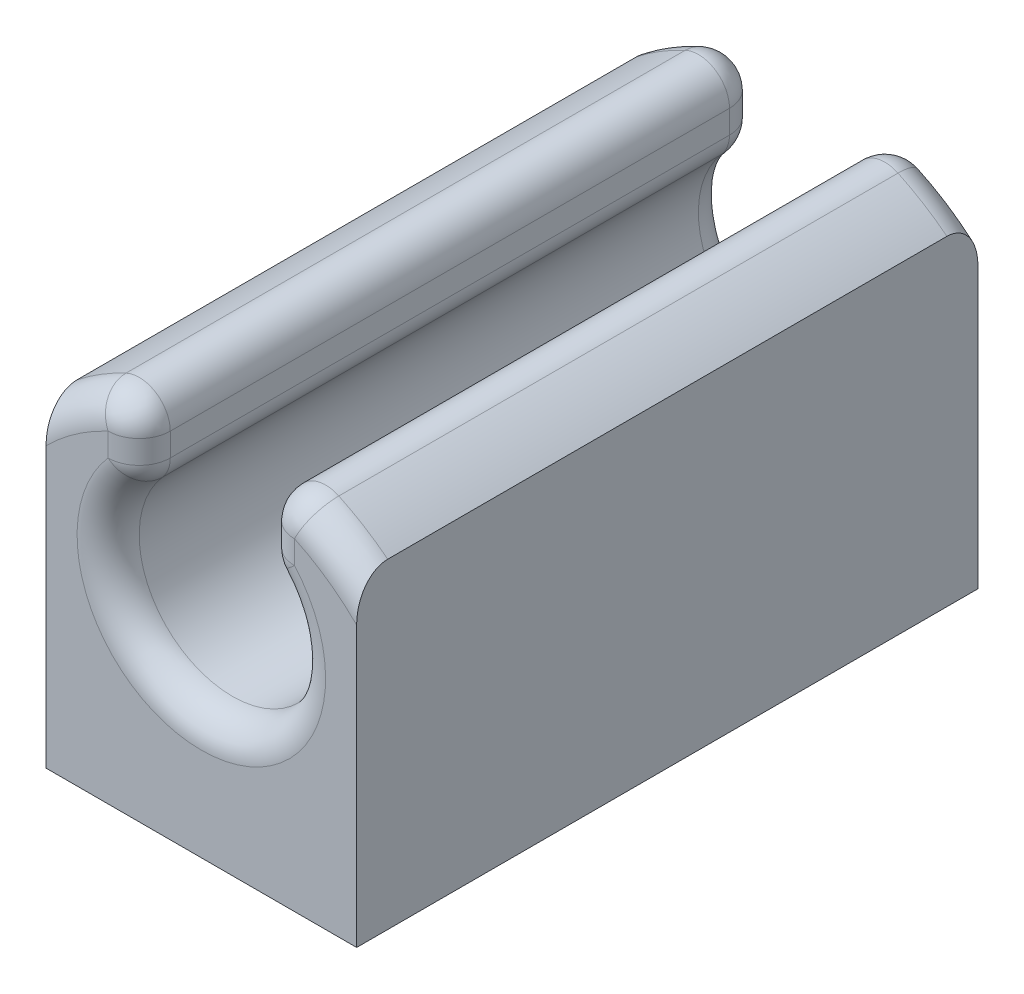
ISO-10303-21;
HEADER;
FILE_DESCRIPTION(('STEP AP214'),'2;1');
FILE_NAME('part.step','',(''),(''),'','','');
FILE_SCHEMA(('AUTOMOTIVE_DESIGN { 1 0 10303 214 1 1 1 1 }'));
ENDSEC;
DATA;
#1=APPLICATION_CONTEXT('core data for automotive mechanical design processes');
#2=APPLICATION_PROTOCOL_DEFINITION('international standard','automotive_design',2000,#1);
#3=PRODUCT_CONTEXT('',#1,'mechanical');
#4=PRODUCT('Part','Part','',(#3));
#5=PRODUCT_RELATED_PRODUCT_CATEGORY('part','',(#4));
#6=PRODUCT_DEFINITION_FORMATION('','',#4);
#7=PRODUCT_DEFINITION_CONTEXT('part definition',#1,'design');
#8=PRODUCT_DEFINITION('design','',#6,#7);
#9=PRODUCT_DEFINITION_SHAPE('','',#8);
#10=(LENGTH_UNIT() NAMED_UNIT(*) SI_UNIT(.MILLI.,.METRE.));
#11=(NAMED_UNIT(*) PLANE_ANGLE_UNIT() SI_UNIT($,.RADIAN.));
#12=(NAMED_UNIT(*) SI_UNIT($,.STERADIAN.) SOLID_ANGLE_UNIT());
#13=UNCERTAINTY_MEASURE_WITH_UNIT(LENGTH_MEASURE(1.E-05),#10,'distance_accuracy_value','');
#14=(GEOMETRIC_REPRESENTATION_CONTEXT(3) GLOBAL_UNCERTAINTY_ASSIGNED_CONTEXT((#13)) GLOBAL_UNIT_ASSIGNED_CONTEXT((#10,
#11,#12)) REPRESENTATION_CONTEXT('',''));
#15=CARTESIAN_POINT('',(0.,0.,0.));
#16=DIRECTION('',(0.,0.,1.));
#17=DIRECTION('',(1.,0.,0.));
#18=AXIS2_PLACEMENT_3D('',#15,#16,#17);
#19=CARTESIAN_POINT('',(0.,-1.5,0.));
#20=DIRECTION('',(0.,0.,1.));
#21=DIRECTION('',(1.,0.,0.));
#22=AXIS2_PLACEMENT_3D('',#19,#20,#21);
#23=CYLINDRICAL_SURFACE('',#22,4.03112887414927);
#24=DIRECTION('',(0.,0.,1.));
#25=VECTOR('',#24,1.);
#26=CARTESIAN_POINT('',(1.71239666597575,2.14934208568547,0.));
#27=LINE('',#26,#25);
#28=CARTESIAN_POINT('',(1.71239666597575,2.14934208568547,0.5));
#29=VERTEX_POINT('',#28);
#30=CARTESIAN_POINT('',(1.71239666597575,2.14934208568547,9.5));
#31=VERTEX_POINT('',#30);
#32=EDGE_CURVE('E275',#29,#31,#27,.T.);
#33=ORIENTED_EDGE('',*,*,#32,.T.);
#34=CARTESIAN_POINT('',(0.,-1.5,9.5));
#35=DIRECTION('',(0.,0.,1.));
#36=DIRECTION('',(1.,0.,0.));
#37=AXIS2_PLACEMENT_3D('',#34,#35,#36);
#38=CIRCLE('',#37,4.03112887414927);
#39=CARTESIAN_POINT('',(2.5,1.66227766016838,9.5));
#40=VERTEX_POINT('',#39);
#41=EDGE_CURVE('E279',#31,#40,#38,.F.);
#42=ORIENTED_EDGE('',*,*,#41,.T.);
#43=DIRECTION('',(0.,0.,1.));
#44=VECTOR('',#43,1.);
#45=CARTESIAN_POINT('',(2.5,1.66227766016838,0.));
#46=LINE('',#45,#44);
#47=CARTESIAN_POINT('',(2.5,1.66227766016838,0.5));
#48=VERTEX_POINT('',#47);
#49=EDGE_CURVE('E174',#48,#40,#46,.T.);
#50=ORIENTED_EDGE('',*,*,#49,.F.);
#51=CARTESIAN_POINT('',(0.,-1.5,0.5));
#52=DIRECTION('',(0.,0.,1.));
#53=DIRECTION('',(1.,0.,0.));
#54=AXIS2_PLACEMENT_3D('',#51,#52,#53);
#55=CIRCLE('',#54,4.03112887414927);
#56=EDGE_CURVE('E277',#48,#29,#55,.T.);
#57=ORIENTED_EDGE('',*,*,#56,.T.);
#58=EDGE_LOOP('',(#33,#42,#50,#57));
#59=FACE_BOUND('',#58,.T.);
#60=ADVANCED_FACE('F35',(#59),#23,.T.);
#61=CARTESIAN_POINT('',(0.,0.,10.));
#62=DIRECTION('',(0.,0.,1.));
#63=DIRECTION('',(1.,0.,0.));
#64=AXIS2_PLACEMENT_3D('',#61,#62,#63);
#65=PLANE('',#64);
#66=DIRECTION('',(0.,-1.,0.));
#67=VECTOR('',#66,1.);
#68=CARTESIAN_POINT('',(2.5,-3.5,10.));
#69=LINE('',#68,#67);
#70=CARTESIAN_POINT('',(2.5,0.993766453750375,10.));
#71=VERTEX_POINT('',#70);
#72=CARTESIAN_POINT('',(2.5,-3.5,10.));
#73=VERTEX_POINT('',#72);
#74=EDGE_CURVE('E181',#71,#73,#69,.T.);
#75=ORIENTED_EDGE('',*,*,#74,.F.);
#76=CARTESIAN_POINT('',(0.,-1.5,10.));
#77=DIRECTION('',(0.,0.,1.));
#78=DIRECTION('',(1.,0.,0.));
#79=AXIS2_PLACEMENT_3D('',#76,#77,#78);
#80=CIRCLE('',#79,3.53112887414928);
#81=CARTESIAN_POINT('',(1.5,1.69669690866224,10.));
#82=VERTEX_POINT('',#81);
#83=EDGE_CURVE('E272',#71,#82,#80,.T.);
#84=ORIENTED_EDGE('',*,*,#83,.T.);
#85=DIRECTION('',(0.,1.,0.));
#86=VECTOR('',#85,1.);
#87=CARTESIAN_POINT('',(1.5,1.73205080756888,10.));
#88=LINE('',#87,#86);
#89=CARTESIAN_POINT('',(1.5,1.3228756555323,10.));
#90=VERTEX_POINT('',#89);
#91=EDGE_CURVE('E216',#82,#90,#88,.F.);
#92=ORIENTED_EDGE('',*,*,#91,.T.);
#93=CARTESIAN_POINT('',(0.,0.,10.));
#94=DIRECTION('',(0.,0.,1.));
#95=DIRECTION('',(1.,0.,0.));
#96=AXIS2_PLACEMENT_3D('',#93,#94,#95);
#97=CIRCLE('',#96,2.);
#98=CARTESIAN_POINT('',(-1.5,1.3228756555323,10.));
#99=VERTEX_POINT('',#98);
#100=EDGE_CURVE('E204',#90,#99,#97,.F.);
#101=ORIENTED_EDGE('',*,*,#100,.T.);
#102=DIRECTION('',(0.,-1.,0.));
#103=VECTOR('',#102,1.);
#104=CARTESIAN_POINT('',(-1.5,2.40512483795333,10.));
#105=LINE('',#104,#103);
#106=CARTESIAN_POINT('',(-1.5,1.69669690866224,10.));
#107=VERTEX_POINT('',#106);
#108=EDGE_CURVE('E251',#99,#107,#105,.F.);
#109=ORIENTED_EDGE('',*,*,#108,.T.);
#110=CARTESIAN_POINT('',(0.,-1.5,10.));
#111=DIRECTION('',(0.,0.,1.));
#112=DIRECTION('',(1.,0.,0.));
#113=AXIS2_PLACEMENT_3D('',#110,#111,#112);
#114=CIRCLE('',#113,3.53112887414928);
#115=CARTESIAN_POINT('',(-2.5,0.993766453750375,10.));
#116=VERTEX_POINT('',#115);
#117=EDGE_CURVE('E258',#107,#116,#114,.T.);
#118=ORIENTED_EDGE('',*,*,#117,.T.);
#119=DIRECTION('',(0.,1.,0.));
#120=VECTOR('',#119,1.);
#121=CARTESIAN_POINT('',(-2.5,0.,10.));
#122=LINE('',#121,#120);
#123=CARTESIAN_POINT('',(-2.5,-3.5,10.));
#124=VERTEX_POINT('',#123);
#125=EDGE_CURVE('E190',#124,#116,#122,.T.);
#126=ORIENTED_EDGE('',*,*,#125,.F.);
#127=DIRECTION('',(1.,0.,0.));
#128=VECTOR('',#127,1.);
#129=CARTESIAN_POINT('',(-3.5,-3.5,10.));
#130=LINE('',#129,#128);
#131=EDGE_CURVE('E189',#124,#73,#130,.T.);
#132=ORIENTED_EDGE('',*,*,#131,.T.);
#133=EDGE_LOOP('',(#75,#84,#92,#101,#109,#118,#126,#132));
#134=FACE_BOUND('',#133,.T.);
#135=ADVANCED_FACE('F347',(#134),#65,.T.);
#136=CARTESIAN_POINT('',(0.,0.,0.));
#137=DIRECTION('',(0.,0.,1.));
#138=DIRECTION('',(1.,0.,0.));
#139=AXIS2_PLACEMENT_3D('',#136,#137,#138);
#140=PLANE('',#139);
#141=DIRECTION('',(0.,1.,0.));
#142=VECTOR('',#141,1.);
#143=CARTESIAN_POINT('',(1.5,0.,0.));
#144=LINE('',#143,#142);
#145=CARTESIAN_POINT('',(1.5,1.3228756555323,0.));
#146=VERTEX_POINT('',#145);
#147=CARTESIAN_POINT('',(1.5,1.69669690866224,0.));
#148=VERTEX_POINT('',#147);
#149=EDGE_CURVE('E221',#146,#148,#144,.T.);
#150=ORIENTED_EDGE('',*,*,#149,.T.);
#151=CARTESIAN_POINT('',(0.,-1.5,0.));
#152=DIRECTION('',(0.,0.,1.));
#153=DIRECTION('',(1.,0.,0.));
#154=AXIS2_PLACEMENT_3D('',#151,#152,#153);
#155=CIRCLE('',#154,3.53112887414928);
#156=CARTESIAN_POINT('',(2.5,0.993766453750376,0.));
#157=VERTEX_POINT('',#156);
#158=EDGE_CURVE('E171',#148,#157,#155,.F.);
#159=ORIENTED_EDGE('',*,*,#158,.T.);
#160=DIRECTION('',(0.,-1.,0.));
#161=VECTOR('',#160,1.);
#162=CARTESIAN_POINT('',(2.5,0.,0.));
#163=LINE('',#162,#161);
#164=CARTESIAN_POINT('',(2.5,-3.5,0.));
#165=VERTEX_POINT('',#164);
#166=EDGE_CURVE('E163',#157,#165,#163,.T.);
#167=ORIENTED_EDGE('',*,*,#166,.T.);
#168=DIRECTION('',(1.,0.,0.));
#169=VECTOR('',#168,1.);
#170=CARTESIAN_POINT('',(-3.5,-3.5,0.));
#171=LINE('',#170,#169);
#172=CARTESIAN_POINT('',(-2.5,-3.5,0.));
#173=VERTEX_POINT('',#172);
#174=EDGE_CURVE('E169',#173,#165,#171,.T.);
#175=ORIENTED_EDGE('',*,*,#174,.F.);
#176=DIRECTION('',(0.,-1.,0.));
#177=VECTOR('',#176,1.);
#178=CARTESIAN_POINT('',(-2.5,-3.5,0.));
#179=LINE('',#178,#177);
#180=CARTESIAN_POINT('',(-2.5,0.993766453750375,0.));
#181=VERTEX_POINT('',#180);
#182=EDGE_CURVE('E428',#181,#173,#179,.T.);
#183=ORIENTED_EDGE('',*,*,#182,.F.);
#184=CARTESIAN_POINT('',(0.,-1.5,0.));
#185=DIRECTION('',(0.,0.,1.));
#186=DIRECTION('',(1.,0.,0.));
#187=AXIS2_PLACEMENT_3D('',#184,#185,#186);
#188=CIRCLE('',#187,3.53112887414928);
#189=CARTESIAN_POINT('',(-1.5,1.69669690866224,0.));
#190=VERTEX_POINT('',#189);
#191=EDGE_CURVE('E392',#181,#190,#188,.F.);
#192=ORIENTED_EDGE('',*,*,#191,.T.);
#193=DIRECTION('',(0.,-1.,0.));
#194=VECTOR('',#193,1.);
#195=CARTESIAN_POINT('',(-1.5,0.,0.));
#196=LINE('',#195,#194);
#197=CARTESIAN_POINT('',(-1.5,1.3228756555323,0.));
#198=VERTEX_POINT('',#197);
#199=EDGE_CURVE('E228',#190,#198,#196,.T.);
#200=ORIENTED_EDGE('',*,*,#199,.T.);
#201=CARTESIAN_POINT('',(0.,0.,0.));
#202=DIRECTION('',(0.,0.,1.));
#203=DIRECTION('',(1.,0.,0.));
#204=AXIS2_PLACEMENT_3D('',#201,#202,#203);
#205=CIRCLE('',#204,2.);
#206=EDGE_CURVE('E207',#198,#146,#205,.T.);
#207=ORIENTED_EDGE('',*,*,#206,.T.);
#208=EDGE_LOOP('',(#150,#159,#167,#175,#183,#192,#200,#207));
#209=FACE_BOUND('',#208,.T.);
#210=ADVANCED_FACE('F166',(#209),#140,.F.);
#211=CARTESIAN_POINT('',(-3.5,-3.5,10.));
#212=DIRECTION('',(0.,1.,0.));
#213=DIRECTION('',(0.,0.,1.));
#214=AXIS2_PLACEMENT_3D('',#211,#212,#213);
#215=PLANE('',#214);
#216=ORIENTED_EDGE('',*,*,#174,.T.);
#217=DIRECTION('',(0.,0.,-1.));
#218=VECTOR('',#217,1.);
#219=CARTESIAN_POINT('',(2.5,-3.5,10.));
#220=LINE('',#219,#218);
#221=EDGE_CURVE('E175',#73,#165,#220,.T.);
#222=ORIENTED_EDGE('',*,*,#221,.F.);
#223=ORIENTED_EDGE('',*,*,#131,.F.);
#224=DIRECTION('',(0.,0.,1.));
#225=VECTOR('',#224,1.);
#226=CARTESIAN_POINT('',(-2.5,-3.5,0.));
#227=LINE('',#226,#225);
#228=EDGE_CURVE('E188',#173,#124,#227,.T.);
#229=ORIENTED_EDGE('',*,*,#228,.F.);
#230=EDGE_LOOP('',(#216,#222,#223,#229));
#231=FACE_BOUND('',#230,.T.);
#232=ADVANCED_FACE('F187',(#231),#215,.F.);
#233=DIRECTION('',(0.,0.,1.));
#234=VECTOR('',#233,1.);
#235=CARTESIAN_POINT('',(-1.71239666597575,2.14934208568547,0.));
#236=LINE('',#235,#234);
#237=CARTESIAN_POINT('',(-1.71239666597575,2.14934208568547,9.5));
#238=VERTEX_POINT('',#237);
#239=CARTESIAN_POINT('',(-1.71239666597575,2.14934208568547,0.5));
#240=VERTEX_POINT('',#239);
#241=EDGE_CURVE('E368',#238,#240,#236,.F.);
#242=ORIENTED_EDGE('',*,*,#241,.T.);
#243=CARTESIAN_POINT('',(0.,-1.5,0.5));
#244=DIRECTION('',(0.,0.,1.));
#245=DIRECTION('',(1.,0.,0.));
#246=AXIS2_PLACEMENT_3D('',#243,#244,#245);
#247=CIRCLE('',#246,4.03112887414927);
#248=CARTESIAN_POINT('',(-2.5,1.66227766016838,0.5));
#249=VERTEX_POINT('',#248);
#250=EDGE_CURVE('E372',#240,#249,#247,.T.);
#251=ORIENTED_EDGE('',*,*,#250,.T.);
#252=DIRECTION('',(0.,0.,1.));
#253=VECTOR('',#252,1.);
#254=CARTESIAN_POINT('',(-2.5,1.66227766016838,0.));
#255=LINE('',#254,#253);
#256=CARTESIAN_POINT('',(-2.5,1.66227766016838,9.5));
#257=VERTEX_POINT('',#256);
#258=EDGE_CURVE('E192',#257,#249,#255,.F.);
#259=ORIENTED_EDGE('',*,*,#258,.F.);
#260=CARTESIAN_POINT('',(0.,-1.5,9.5));
#261=DIRECTION('',(0.,0.,1.));
#262=DIRECTION('',(1.,0.,0.));
#263=AXIS2_PLACEMENT_3D('',#260,#261,#262);
#264=CIRCLE('',#263,4.03112887414927);
#265=EDGE_CURVE('E374',#257,#238,#264,.F.);
#266=ORIENTED_EDGE('',*,*,#265,.T.);
#267=EDGE_LOOP('',(#242,#251,#259,#266));
#268=FACE_BOUND('',#267,.T.);
#269=ADVANCED_FACE('F350',(#268),#23,.T.);
#270=CARTESIAN_POINT('',(0.,0.,0.));
#271=DIRECTION('',(0.,0.,1.));
#272=DIRECTION('',(1.,0.,0.));
#273=AXIS2_PLACEMENT_3D('',#270,#271,#272);
#274=CYLINDRICAL_SURFACE('',#273,1.5);
#275=CARTESIAN_POINT('',(0.,0.,0.5));
#276=DIRECTION('',(0.,0.,1.));
#277=DIRECTION('',(1.,0.,0.));
#278=AXIS2_PLACEMENT_3D('',#275,#276,#277);
#279=CIRCLE('',#278,1.5);
#280=CARTESIAN_POINT('',(1.125,0.992156741649222,0.5));
#281=VERTEX_POINT('',#280);
#282=CARTESIAN_POINT('',(-1.125,0.992156741649222,0.5));
#283=VERTEX_POINT('',#282);
#284=EDGE_CURVE('E199',#281,#283,#279,.F.);
#285=ORIENTED_EDGE('',*,*,#284,.T.);
#286=DIRECTION('',(0.,0.,1.));
#287=VECTOR('',#286,1.);
#288=CARTESIAN_POINT('',(-1.125,0.992156741649222,0.));
#289=LINE('',#288,#287);
#290=CARTESIAN_POINT('',(-1.125,0.992156741649222,9.5));
#291=VERTEX_POINT('',#290);
#292=EDGE_CURVE('E256',#283,#291,#289,.T.);
#293=ORIENTED_EDGE('',*,*,#292,.T.);
#294=CARTESIAN_POINT('',(0.,0.,9.5));
#295=DIRECTION('',(0.,0.,1.));
#296=DIRECTION('',(1.,0.,0.));
#297=AXIS2_PLACEMENT_3D('',#294,#295,#296);
#298=CIRCLE('',#297,1.5);
#299=CARTESIAN_POINT('',(1.125,0.992156741649222,9.5));
#300=VERTEX_POINT('',#299);
#301=EDGE_CURVE('E202',#291,#300,#298,.T.);
#302=ORIENTED_EDGE('',*,*,#301,.T.);
#303=DIRECTION('',(0.,0.,1.));
#304=VECTOR('',#303,1.);
#305=CARTESIAN_POINT('',(1.125,0.992156741649222,0.));
#306=LINE('',#305,#304);
#307=EDGE_CURVE('E226',#300,#281,#306,.F.);
#308=ORIENTED_EDGE('',*,*,#307,.T.);
#309=EDGE_LOOP('',(#285,#293,#302,#308));
#310=FACE_BOUND('',#309,.T.);
#311=ADVANCED_FACE('F358',(#310),#274,.F.);
#312=CARTESIAN_POINT('',(-1.,2.73267556107915,0.));
#313=DIRECTION('',(-1.,0.,0.));
#314=DIRECTION('',(0.,-1.,0.));
#315=AXIS2_PLACEMENT_3D('',#312,#313,#314);
#316=PLANE('',#315);
#317=DIRECTION('',(0.,-1.,0.));
#318=VECTOR('',#317,1.);
#319=CARTESIAN_POINT('',(-1.,2.73267556107915,0.5));
#320=LINE('',#319,#318);
#321=CARTESIAN_POINT('',(-1.,1.3228756555323,0.5));
#322=VERTEX_POINT('',#321);
#323=CARTESIAN_POINT('',(-1.,1.69669690866224,0.5));
#324=VERTEX_POINT('',#323);
#325=EDGE_CURVE('E247',#322,#324,#320,.F.);
#326=ORIENTED_EDGE('',*,*,#325,.T.);
#327=DIRECTION('',(0.,0.,-1.));
#328=VECTOR('',#327,1.);
#329=CARTESIAN_POINT('',(-1.,1.69669690866224,9.5));
#330=LINE('',#329,#328);
#331=CARTESIAN_POINT('',(-1.,1.69669690866224,9.5));
#332=VERTEX_POINT('',#331);
#333=EDGE_CURVE('E11',#324,#332,#330,.F.);
#334=ORIENTED_EDGE('',*,*,#333,.T.);
#335=DIRECTION('',(0.,-1.,0.));
#336=VECTOR('',#335,1.);
#337=CARTESIAN_POINT('',(-1.,1.73205080756888,9.5));
#338=LINE('',#337,#336);
#339=CARTESIAN_POINT('',(-1.,1.3228756555323,9.5));
#340=VERTEX_POINT('',#339);
#341=EDGE_CURVE('E245',#332,#340,#338,.T.);
#342=ORIENTED_EDGE('',*,*,#341,.T.);
#343=DIRECTION('',(0.,0.,1.));
#344=VECTOR('',#343,1.);
#345=CARTESIAN_POINT('',(-1.,1.3228756555323,0.));
#346=LINE('',#345,#344);
#347=EDGE_CURVE('E243',#340,#322,#346,.F.);
#348=ORIENTED_EDGE('',*,*,#347,.T.);
#349=EDGE_LOOP('',(#326,#334,#342,#348));
#350=FACE_BOUND('',#349,.T.);
#351=ADVANCED_FACE('F309',(#350),#316,.F.);
#352=CARTESIAN_POINT('',(1.,2.73267556107915,0.));
#353=DIRECTION('',(1.,0.,0.));
#354=DIRECTION('',(0.,1.,0.));
#355=AXIS2_PLACEMENT_3D('',#352,#353,#354);
#356=PLANE('',#355);
#357=DIRECTION('',(0.,1.,0.));
#358=VECTOR('',#357,1.);
#359=CARTESIAN_POINT('',(1.,2.40512483795333,9.5));
#360=LINE('',#359,#358);
#361=CARTESIAN_POINT('',(1.,1.3228756555323,9.5));
#362=VERTEX_POINT('',#361);
#363=CARTESIAN_POINT('',(1.,1.69669690866224,9.5));
#364=VERTEX_POINT('',#363);
#365=EDGE_CURVE('E213',#362,#364,#360,.T.);
#366=ORIENTED_EDGE('',*,*,#365,.T.);
#367=DIRECTION('',(0.,0.,-1.));
#368=VECTOR('',#367,1.);
#369=CARTESIAN_POINT('',(1.,1.69669690866224,0.5));
#370=LINE('',#369,#368);
#371=CARTESIAN_POINT('',(1.,1.69669690866224,0.5));
#372=VERTEX_POINT('',#371);
#373=EDGE_CURVE('E45',#364,#372,#370,.T.);
#374=ORIENTED_EDGE('',*,*,#373,.T.);
#375=DIRECTION('',(0.,1.,0.));
#376=VECTOR('',#375,1.);
#377=CARTESIAN_POINT('',(1.,2.73267556107915,0.5));
#378=LINE('',#377,#376);
#379=CARTESIAN_POINT('',(1.,1.3228756555323,0.5));
#380=VERTEX_POINT('',#379);
#381=EDGE_CURVE('E211',#372,#380,#378,.F.);
#382=ORIENTED_EDGE('',*,*,#381,.T.);
#383=DIRECTION('',(0.,0.,1.));
#384=VECTOR('',#383,1.);
#385=CARTESIAN_POINT('',(1.,1.3228756555323,0.));
#386=LINE('',#385,#384);
#387=EDGE_CURVE('E209',#380,#362,#386,.T.);
#388=ORIENTED_EDGE('',*,*,#387,.T.);
#389=EDGE_LOOP('',(#366,#374,#382,#388));
#390=FACE_BOUND('',#389,.T.);
#391=ADVANCED_FACE('F307',(#390),#356,.F.);
#392=CARTESIAN_POINT('',(-2.5,0.,0.));
#393=DIRECTION('',(1.,0.,0.));
#394=DIRECTION('',(0.,1.,0.));
#395=AXIS2_PLACEMENT_3D('',#392,#393,#394);
#396=PLANE('',#395);
#397=ORIENTED_EDGE('',*,*,#258,.T.);
#398=CARTESIAN_POINT('',(-2.5,1.66227766016838,0.5));
#399=CARTESIAN_POINT('',(-2.5,1.66232077918021,0.476304674534329));
#400=CARTESIAN_POINT('',(-2.5,1.66013370792202,0.452646607475394));
#401=CARTESIAN_POINT('',(-2.5,1.65165641899006,0.406215760189243));
#402=CARTESIAN_POINT('',(-2.5,1.64539049226528,0.383438579389136));
#403=CARTESIAN_POINT('',(-2.5,1.62911727138701,0.339317295613441));
#404=CARTESIAN_POINT('',(-2.5,1.61911549801442,0.317971132532818));
#405=CARTESIAN_POINT('',(-2.5,1.59588464325179,0.277097798122869));
#406=CARTESIAN_POINT('',(-2.5,1.58265143800617,0.257572995512234));
#407=CARTESIAN_POINT('',(-2.5,1.55255488517263,0.219426529009171));
#408=CARTESIAN_POINT('',(-2.5,1.53550980201501,0.200949134813798));
#409=CARTESIAN_POINT('',(-2.5,1.49903707999838,0.166553835794158));
#410=CARTESIAN_POINT('',(-2.5,1.47960933879054,0.1506360409873));
#411=CARTESIAN_POINT('',(-2.5,1.42867344287397,0.113995908141239));
#412=CARTESIAN_POINT('',(-2.5,1.39600308615875,0.0948825068169988));
#413=CARTESIAN_POINT('',(-2.5,1.32791643207717,0.0621447909442878));
#414=CARTESIAN_POINT('',(-2.5,1.29248868723036,0.0485449934419612));
#415=CARTESIAN_POINT('',(-2.5,1.21363631074044,0.024540389036504));
#416=CARTESIAN_POINT('',(-2.5,1.1699120174574,0.015137431583785));
#417=CARTESIAN_POINT('',(-2.5,1.08199515840217,0.00290912052731755));
#418=CARTESIAN_POINT('',(-2.5,1.03781209532501,1.68251955861677E-05));
#419=CARTESIAN_POINT('',(-2.5,0.993766453750375,0.));
#420=B_SPLINE_CURVE_WITH_KNOTS('',3,(#398,#399,#400,#401,#402,#403,#404,#405,#406,#407,#408,
#409,#410,#411,#412,#413,#414,#415,#416,#417,#418,#419),.UNSPECIFIED.,.F.,.F.,(4,2,2,2,2,2,2,2,
2,2,4),(0.,0.0709264220108089,0.14143427071576,0.211838333534092,0.282332717798463,
0.357471877886496,0.432614266763932,0.545541721320132,0.658965957445471,0.792611379646446,
0.924876276889545),.UNSPECIFIED.);
#421=EDGE_CURVE('E319',#249,#181,#420,.T.);
#422=ORIENTED_EDGE('',*,*,#421,.T.);
#423=ORIENTED_EDGE('',*,*,#182,.T.);
#424=ORIENTED_EDGE('',*,*,#228,.T.);
#425=ORIENTED_EDGE('',*,*,#125,.T.);
#426=CARTESIAN_POINT('',(-2.5,0.993766453750375,10.));
#427=CARTESIAN_POINT('',(-2.5,1.0357069136894,9.99998469341569));
#428=CARTESIAN_POINT('',(-2.5,1.07775462195223,9.99736303422244));
#429=CARTESIAN_POINT('',(-2.5,1.16142830277469,9.98631956637834));
#430=CARTESIAN_POINT('',(-2.5,1.20304769859404,9.97784887897191));
#431=CARTESIAN_POINT('',(-2.5,1.27962014382049,9.95589611600509));
#432=CARTESIAN_POINT('',(-2.5,1.31477555279246,9.94313372211331));
#433=CARTESIAN_POINT('',(-2.5,1.3825907188917,9.91225988928464));
#434=CARTESIAN_POINT('',(-2.5,1.41525763850054,9.8941645931689));
#435=CARTESIAN_POINT('',(-2.5,1.47032540638765,9.85674255023804));
#436=CARTESIAN_POINT('',(-2.5,1.49344164710429,9.8384720816908));
#437=CARTESIAN_POINT('',(-2.5,1.53642505987154,9.79841208958501));
#438=CARTESIAN_POINT('',(-2.5,1.55629456934445,9.77662512032694));
#439=CARTESIAN_POINT('',(-2.5,1.58882890899494,9.73364884108992));
#440=CARTESIAN_POINT('',(-2.5,1.60214124314595,9.71295085696929));
#441=CARTESIAN_POINT('',(-2.5,1.62513548307283,9.66964388362657));
#442=CARTESIAN_POINT('',(-2.5,1.63482337742583,9.647038123018));
#443=CARTESIAN_POINT('',(-2.5,1.64891793424122,9.6038495633674));
#444=CARTESIAN_POINT('',(-2.5,1.65388751393434,9.5834502413432));
#445=CARTESIAN_POINT('',(-2.5,1.66058701269638,9.54204378718783));
#446=CARTESIAN_POINT('',(-2.5,1.66230358090932,9.52103450800178));
#447=CARTESIAN_POINT('',(-2.5,1.66227766016838,9.5));
#448=B_SPLINE_CURVE_WITH_KNOTS('',3,(#426,#427,#428,#429,#430,#431,#432,#433,#434,#435,#436,
#437,#438,#439,#440,#441,#442,#443,#444,#445,#446,#447),.UNSPECIFIED.,.F.,.F.,(4,2,2,2,2,2,2,2,
2,2,4),(0.,0.125911893795168,0.252888939374309,0.364694804281864,0.476165646748438,
0.564231764464103,0.652234198622641,0.72575916121634,0.799162098009831,0.861897029738093,
0.92488888225349),.UNSPECIFIED.);
#449=EDGE_CURVE('E313',#116,#257,#448,.T.);
#450=ORIENTED_EDGE('',*,*,#449,.T.);
#451=EDGE_LOOP('',(#397,#422,#423,#424,#425,#450));
#452=FACE_BOUND('',#451,.T.);
#453=ADVANCED_FACE('F302',(#452),#396,.F.);
#454=CARTESIAN_POINT('',(2.5,0.,0.));
#455=DIRECTION('',(-1.,0.,0.));
#456=DIRECTION('',(0.,-1.,0.));
#457=AXIS2_PLACEMENT_3D('',#454,#455,#456);
#458=PLANE('',#457);
#459=ORIENTED_EDGE('',*,*,#49,.T.);
#460=CARTESIAN_POINT('',(2.5,1.66227766016838,9.5));
#461=CARTESIAN_POINT('',(2.5,1.66232077918021,9.52369532546567));
#462=CARTESIAN_POINT('',(2.5,1.66013370792202,9.54735339252461));
#463=CARTESIAN_POINT('',(2.5,1.65165641899006,9.59378423981076));
#464=CARTESIAN_POINT('',(2.5,1.64539049226528,9.61656142061086));
#465=CARTESIAN_POINT('',(2.5,1.62911727138701,9.66068270438656));
#466=CARTESIAN_POINT('',(2.5,1.61911549801442,9.68202886746718));
#467=CARTESIAN_POINT('',(2.5,1.59588464325179,9.72290220187713));
#468=CARTESIAN_POINT('',(2.5,1.58265143800617,9.74242700448777));
#469=CARTESIAN_POINT('',(2.5,1.55255488517263,9.78057347099083));
#470=CARTESIAN_POINT('',(2.5,1.53550980201501,9.7990508651862));
#471=CARTESIAN_POINT('',(2.5,1.49903707999838,9.83344616420584));
#472=CARTESIAN_POINT('',(2.5,1.47960933879053,9.8493639590127));
#473=CARTESIAN_POINT('',(2.5,1.42867344287397,9.88600409185876));
#474=CARTESIAN_POINT('',(2.5,1.39600308615874,9.905117493183));
#475=CARTESIAN_POINT('',(2.5,1.32791643207717,9.93785520905571));
#476=CARTESIAN_POINT('',(2.5,1.29248868723036,9.95145500655804));
#477=CARTESIAN_POINT('',(2.5,1.21363631074043,9.9754596109635));
#478=CARTESIAN_POINT('',(2.5,1.16991201745739,9.98486256841622));
#479=CARTESIAN_POINT('',(2.5,1.08199515840217,9.99709087947268));
#480=CARTESIAN_POINT('',(2.5,1.03781209532501,9.99998317480441));
#481=CARTESIAN_POINT('',(2.5,0.993766453750376,10.));
#482=B_SPLINE_CURVE_WITH_KNOTS('',3,(#460,#461,#462,#463,#464,#465,#466,#467,#468,#469,#470,
#471,#472,#473,#474,#475,#476,#477,#478,#479,#480,#481),.UNSPECIFIED.,.F.,.F.,(4,2,2,2,2,2,2,2,
2,2,4),(0.,0.0709264220108098,0.14143427071576,0.211838333534092,0.282332717798461,
0.357471877886496,0.432614266763934,0.545541721320135,0.658965957445477,0.792611379646449,
0.924876276889544),.UNSPECIFIED.);
#483=EDGE_CURVE('E288',#40,#71,#482,.T.);
#484=ORIENTED_EDGE('',*,*,#483,.T.);
#485=ORIENTED_EDGE('',*,*,#74,.T.);
#486=ORIENTED_EDGE('',*,*,#221,.T.);
#487=ORIENTED_EDGE('',*,*,#166,.F.);
#488=CARTESIAN_POINT('',(2.5,0.993766453750376,0.));
#489=CARTESIAN_POINT('',(2.5,1.0357069136894,1.53065843088306E-05));
#490=CARTESIAN_POINT('',(2.5,1.07775462195223,0.0026369657775608));
#491=CARTESIAN_POINT('',(2.5,1.16142830277469,0.0136804336216579));
#492=CARTESIAN_POINT('',(2.5,1.20304769859404,0.0221511210280879));
#493=CARTESIAN_POINT('',(2.5,1.27962014382049,0.0441038839949056));
#494=CARTESIAN_POINT('',(2.5,1.31477555279246,0.0568662778866884));
#495=CARTESIAN_POINT('',(2.5,1.3825907188917,0.0877401107153618));
#496=CARTESIAN_POINT('',(2.5,1.41525763850054,0.105835406831096));
#497=CARTESIAN_POINT('',(2.5,1.47032540638765,0.143257449761958));
#498=CARTESIAN_POINT('',(2.5,1.49344164710429,0.161527918309198));
#499=CARTESIAN_POINT('',(2.5,1.53642505987154,0.201587910414991));
#500=CARTESIAN_POINT('',(2.5,1.55629456934445,0.223374879673058));
#501=CARTESIAN_POINT('',(2.5,1.58882890899494,0.266351158910077));
#502=CARTESIAN_POINT('',(2.5,1.60214124314595,0.287049143030707));
#503=CARTESIAN_POINT('',(2.5,1.62513548307283,0.330356116373431));
#504=CARTESIAN_POINT('',(2.5,1.63482337742583,0.352961876982006));
#505=CARTESIAN_POINT('',(2.5,1.64891793424122,0.396150436632604));
#506=CARTESIAN_POINT('',(2.5,1.65388751393434,0.4165497586568));
#507=CARTESIAN_POINT('',(2.5,1.66058701269638,0.45795621281217));
#508=CARTESIAN_POINT('',(2.5,1.66230358090933,0.478965491998222));
#509=CARTESIAN_POINT('',(2.5,1.66227766016838,0.5));
#510=B_SPLINE_CURVE_WITH_KNOTS('',3,(#488,#489,#490,#491,#492,#493,#494,#495,#496,#497,#498,
#499,#500,#501,#502,#503,#504,#505,#506,#507,#508,#509),.UNSPECIFIED.,.F.,.F.,(4,2,2,2,2,2,2,2,
2,2,4),(0.,0.125911893795168,0.252888939374309,0.364694804281862,0.476165646748437,
0.564231764464103,0.652234198622642,0.725759161216344,0.799162098009832,0.861897029738092,
0.924888882253488),.UNSPECIFIED.);
#511=EDGE_CURVE('E281',#157,#48,#510,.T.);
#512=ORIENTED_EDGE('',*,*,#511,.T.);
#513=EDGE_LOOP('',(#459,#484,#485,#486,#487,#512));
#514=FACE_BOUND('',#513,.T.);
#515=ADVANCED_FACE('F179',(#514),#458,.F.);
#516=CARTESIAN_POINT('',(0.,0.,9.5));
#517=DIRECTION('',(0.,0.,1.));
#518=DIRECTION('',(1.,0.,0.));
#519=AXIS2_PLACEMENT_3D('',#516,#517,#518);
#520=TOROIDAL_SURFACE('',#519,2.,0.5);
#521=ORIENTED_EDGE('',*,*,#301,.F.);
#522=CARTESIAN_POINT('',(-1.5,1.3228756555323,9.5));
#523=DIRECTION('',(-0.661437827766148,-0.75,0.));
#524=DIRECTION('',(0.75,-0.661437827766148,0.));
#525=AXIS2_PLACEMENT_3D('',#522,#523,#524);
#526=CIRCLE('',#525,0.5);
#527=EDGE_CURVE('E254',#291,#99,#526,.T.);
#528=ORIENTED_EDGE('',*,*,#527,.T.);
#529=ORIENTED_EDGE('',*,*,#100,.F.);
#530=CARTESIAN_POINT('',(1.5,1.3228756555323,9.5));
#531=DIRECTION('',(-0.661437827766148,0.75,0.));
#532=DIRECTION('',(-0.75,-0.661437827766148,0.));
#533=AXIS2_PLACEMENT_3D('',#530,#531,#532);
#534=CIRCLE('',#533,0.5);
#535=EDGE_CURVE('E218',#90,#300,#534,.F.);
#536=ORIENTED_EDGE('',*,*,#535,.T.);
#537=EDGE_LOOP('',(#521,#528,#529,#536));
#538=FACE_BOUND('',#537,.T.);
#539=ADVANCED_FACE('F301',(#538),#520,.T.);
#540=CARTESIAN_POINT('',(0.,0.,0.5));
#541=DIRECTION('',(0.,0.,1.));
#542=DIRECTION('',(1.,0.,0.));
#543=AXIS2_PLACEMENT_3D('',#540,#541,#542);
#544=TOROIDAL_SURFACE('',#543,2.,0.5);
#545=ORIENTED_EDGE('',*,*,#206,.F.);
#546=CARTESIAN_POINT('',(-1.5,1.3228756555323,0.5));
#547=DIRECTION('',(-0.661437827766148,-0.75,0.));
#548=DIRECTION('',(0.75,-0.661437827766148,0.));
#549=AXIS2_PLACEMENT_3D('',#546,#547,#548);
#550=CIRCLE('',#549,0.5);
#551=EDGE_CURVE('E249',#198,#283,#550,.T.);
#552=ORIENTED_EDGE('',*,*,#551,.T.);
#553=ORIENTED_EDGE('',*,*,#284,.F.);
#554=CARTESIAN_POINT('',(1.5,1.3228756555323,0.5));
#555=DIRECTION('',(-0.661437827766148,0.75,0.));
#556=DIRECTION('',(-0.75,-0.661437827766148,0.));
#557=AXIS2_PLACEMENT_3D('',#554,#555,#556);
#558=CIRCLE('',#557,0.5);
#559=EDGE_CURVE('E223',#281,#146,#558,.F.);
#560=ORIENTED_EDGE('',*,*,#559,.T.);
#561=EDGE_LOOP('',(#545,#552,#553,#560));
#562=FACE_BOUND('',#561,.T.);
#563=ADVANCED_FACE('F441',(#562),#544,.T.);
#564=CARTESIAN_POINT('',(1.5,0.,0.5));
#565=DIRECTION('',(0.,1.,0.));
#566=DIRECTION('',(-1.,0.,0.));
#567=AXIS2_PLACEMENT_3D('',#564,#565,#566);
#568=CYLINDRICAL_SURFACE('',#567,0.5);
#569=ORIENTED_EDGE('',*,*,#381,.F.);
#570=CARTESIAN_POINT('',(1.5,1.69669690866224,0.5));
#571=DIRECTION('',(0.,1.,0.));
#572=DIRECTION('',(-1.,0.,0.));
#573=AXIS2_PLACEMENT_3D('',#570,#571,#572);
#574=CIRCLE('',#573,0.5);
#575=EDGE_CURVE('E377',#372,#148,#574,.F.);
#576=ORIENTED_EDGE('',*,*,#575,.T.);
#577=ORIENTED_EDGE('',*,*,#149,.F.);
#578=CARTESIAN_POINT('',(1.5,1.3228756555323,0.5));
#579=DIRECTION('',(0.,-1.,0.));
#580=DIRECTION('',(0.,0.,-1.));
#581=AXIS2_PLACEMENT_3D('',#578,#579,#580);
#582=CIRCLE('',#581,0.5);
#583=EDGE_CURVE('E239',#380,#146,#582,.T.);
#584=ORIENTED_EDGE('',*,*,#583,.F.);
#585=EDGE_LOOP('',(#569,#576,#577,#584));
#586=FACE_BOUND('',#585,.T.);
#587=ADVANCED_FACE('F481',(#586),#568,.T.);
#588=CARTESIAN_POINT('',(1.5,1.3228756555323,0.5));
#589=DIRECTION('',(1.,0.,0.));
#590=DIRECTION('',(0.,1.,0.));
#591=AXIS2_PLACEMENT_3D('',#588,#589,#590);
#592=SPHERICAL_SURFACE('',#591,0.5);
#593=ORIENTED_EDGE('',*,*,#583,.T.);
#594=ORIENTED_EDGE('',*,*,#559,.F.);
#595=CARTESIAN_POINT('',(1.5,1.3228756555323,0.5));
#596=DIRECTION('',(0.,0.,1.));
#597=DIRECTION('',(1.,0.,0.));
#598=AXIS2_PLACEMENT_3D('',#595,#596,#597);
#599=CIRCLE('',#598,0.5);
#600=EDGE_CURVE('E236',#380,#281,#599,.T.);
#601=ORIENTED_EDGE('',*,*,#600,.F.);
#602=EDGE_LOOP('',(#593,#594,#601));
#603=FACE_BOUND('',#602,.T.);
#604=ADVANCED_FACE('F484',(#603),#592,.T.);
#605=CARTESIAN_POINT('',(1.5,1.3228756555323,0.));
#606=DIRECTION('',(0.,0.,1.));
#607=DIRECTION('',(1.,0.,0.));
#608=AXIS2_PLACEMENT_3D('',#605,#606,#607);
#609=CYLINDRICAL_SURFACE('',#608,0.5);
#610=ORIENTED_EDGE('',*,*,#600,.T.);
#611=ORIENTED_EDGE('',*,*,#307,.F.);
#612=CARTESIAN_POINT('',(1.5,1.3228756555323,9.5));
#613=DIRECTION('',(0.,0.,1.));
#614=DIRECTION('',(1.,0.,0.));
#615=AXIS2_PLACEMENT_3D('',#612,#613,#614);
#616=CIRCLE('',#615,0.5);
#617=EDGE_CURVE('E232',#362,#300,#616,.T.);
#618=ORIENTED_EDGE('',*,*,#617,.F.);
#619=ORIENTED_EDGE('',*,*,#387,.F.);
#620=EDGE_LOOP('',(#610,#611,#618,#619));
#621=FACE_BOUND('',#620,.T.);
#622=ADVANCED_FACE('F487',(#621),#609,.T.);
#623=CARTESIAN_POINT('',(1.5,1.3228756555323,9.5));
#624=DIRECTION('',(1.,0.,0.));
#625=DIRECTION('',(0.,1.,0.));
#626=AXIS2_PLACEMENT_3D('',#623,#624,#625);
#627=SPHERICAL_SURFACE('',#626,0.5);
#628=ORIENTED_EDGE('',*,*,#617,.T.);
#629=ORIENTED_EDGE('',*,*,#535,.F.);
#630=CARTESIAN_POINT('',(1.5,1.3228756555323,9.5));
#631=DIRECTION('',(0.,1.,0.));
#632=DIRECTION('',(0.,0.,1.));
#633=AXIS2_PLACEMENT_3D('',#630,#631,#632);
#634=CIRCLE('',#633,0.5);
#635=EDGE_CURVE('E229',#362,#90,#634,.T.);
#636=ORIENTED_EDGE('',*,*,#635,.F.);
#637=EDGE_LOOP('',(#628,#629,#636));
#638=FACE_BOUND('',#637,.T.);
#639=ADVANCED_FACE('F491',(#638),#627,.T.);
#640=CARTESIAN_POINT('',(1.5,2.73267556107915,9.5));
#641=DIRECTION('',(0.,-1.,0.));
#642=DIRECTION('',(1.,0.,0.));
#643=AXIS2_PLACEMENT_3D('',#640,#641,#642);
#644=CYLINDRICAL_SURFACE('',#643,0.5);
#645=ORIENTED_EDGE('',*,*,#91,.F.);
#646=CARTESIAN_POINT('',(1.5,1.69669690866224,9.5));
#647=DIRECTION('',(0.,-1.,0.));
#648=DIRECTION('',(1.,0.,0.));
#649=AXIS2_PLACEMENT_3D('',#646,#647,#648);
#650=CIRCLE('',#649,0.5);
#651=EDGE_CURVE('E393',#82,#364,#650,.T.);
#652=ORIENTED_EDGE('',*,*,#651,.T.);
#653=ORIENTED_EDGE('',*,*,#365,.F.);
#654=ORIENTED_EDGE('',*,*,#635,.T.);
#655=EDGE_LOOP('',(#645,#652,#653,#654));
#656=FACE_BOUND('',#655,.T.);
#657=ADVANCED_FACE('F468',(#656),#644,.T.);
#658=CARTESIAN_POINT('',(-1.5,2.73267556107915,9.5));
#659=DIRECTION('',(0.,1.,0.));
#660=DIRECTION('',(-1.,0.,0.));
#661=AXIS2_PLACEMENT_3D('',#658,#659,#660);
#662=CYLINDRICAL_SURFACE('',#661,0.5);
#663=ORIENTED_EDGE('',*,*,#341,.F.);
#664=CARTESIAN_POINT('',(-1.5,1.69669690866224,9.5));
#665=DIRECTION('',(0.,1.,0.));
#666=DIRECTION('',(-1.,0.,0.));
#667=AXIS2_PLACEMENT_3D('',#664,#665,#666);
#668=CIRCLE('',#667,0.5);
#669=EDGE_CURVE('E424',#332,#107,#668,.F.);
#670=ORIENTED_EDGE('',*,*,#669,.T.);
#671=ORIENTED_EDGE('',*,*,#108,.F.);
#672=CARTESIAN_POINT('',(-1.5,1.3228756555323,9.5));
#673=DIRECTION('',(0.,-1.,0.));
#674=DIRECTION('',(0.,0.,-1.));
#675=AXIS2_PLACEMENT_3D('',#672,#673,#674);
#676=CIRCLE('',#675,0.5);
#677=EDGE_CURVE('E233',#340,#99,#676,.T.);
#678=ORIENTED_EDGE('',*,*,#677,.F.);
#679=EDGE_LOOP('',(#663,#670,#671,#678));
#680=FACE_BOUND('',#679,.T.);
#681=ADVANCED_FACE('F464',(#680),#662,.T.);
#682=CARTESIAN_POINT('',(-1.5,1.3228756555323,9.5));
#683=DIRECTION('',(-1.,0.,0.));
#684=DIRECTION('',(0.,-1.,0.));
#685=AXIS2_PLACEMENT_3D('',#682,#683,#684);
#686=SPHERICAL_SURFACE('',#685,0.5);
#687=ORIENTED_EDGE('',*,*,#677,.T.);
#688=ORIENTED_EDGE('',*,*,#527,.F.);
#689=CARTESIAN_POINT('',(-1.5,1.3228756555323,9.5));
#690=DIRECTION('',(0.,0.,-1.));
#691=DIRECTION('',(-1.,0.,0.));
#692=AXIS2_PLACEMENT_3D('',#689,#690,#691);
#693=CIRCLE('',#692,0.5);
#694=EDGE_CURVE('E266',#340,#291,#693,.T.);
#695=ORIENTED_EDGE('',*,*,#694,.F.);
#696=EDGE_LOOP('',(#687,#688,#695));
#697=FACE_BOUND('',#696,.T.);
#698=ADVANCED_FACE('F467',(#697),#686,.T.);
#699=CARTESIAN_POINT('',(-1.5,1.3228756555323,0.));
#700=DIRECTION('',(0.,0.,1.));
#701=DIRECTION('',(1.,0.,0.));
#702=AXIS2_PLACEMENT_3D('',#699,#700,#701);
#703=CYLINDRICAL_SURFACE('',#702,0.5);
#704=ORIENTED_EDGE('',*,*,#694,.T.);
#705=ORIENTED_EDGE('',*,*,#292,.F.);
#706=CARTESIAN_POINT('',(-1.5,1.3228756555323,0.5));
#707=DIRECTION('',(0.,0.,-1.));
#708=DIRECTION('',(-1.,0.,0.));
#709=AXIS2_PLACEMENT_3D('',#706,#707,#708);
#710=CIRCLE('',#709,0.5);
#711=EDGE_CURVE('E262',#322,#283,#710,.T.);
#712=ORIENTED_EDGE('',*,*,#711,.F.);
#713=ORIENTED_EDGE('',*,*,#347,.F.);
#714=EDGE_LOOP('',(#704,#705,#712,#713));
#715=FACE_BOUND('',#714,.T.);
#716=ADVANCED_FACE('F472',(#715),#703,.T.);
#717=CARTESIAN_POINT('',(-1.5,1.3228756555323,0.5));
#718=DIRECTION('',(-1.,0.,0.));
#719=DIRECTION('',(0.,-1.,0.));
#720=AXIS2_PLACEMENT_3D('',#717,#718,#719);
#721=SPHERICAL_SURFACE('',#720,0.5);
#722=ORIENTED_EDGE('',*,*,#711,.T.);
#723=ORIENTED_EDGE('',*,*,#551,.F.);
#724=CARTESIAN_POINT('',(-1.5,1.3228756555323,0.5));
#725=DIRECTION('',(0.,1.,0.));
#726=DIRECTION('',(0.,0.,1.));
#727=AXIS2_PLACEMENT_3D('',#724,#725,#726);
#728=CIRCLE('',#727,0.5);
#729=EDGE_CURVE('E259',#322,#198,#728,.T.);
#730=ORIENTED_EDGE('',*,*,#729,.F.);
#731=EDGE_LOOP('',(#722,#723,#730));
#732=FACE_BOUND('',#731,.T.);
#733=ADVANCED_FACE('F437',(#732),#721,.T.);
#734=CARTESIAN_POINT('',(-1.5,0.,0.5));
#735=DIRECTION('',(0.,-1.,0.));
#736=DIRECTION('',(1.,0.,0.));
#737=AXIS2_PLACEMENT_3D('',#734,#735,#736);
#738=CYLINDRICAL_SURFACE('',#737,0.5);
#739=ORIENTED_EDGE('',*,*,#199,.F.);
#740=CARTESIAN_POINT('',(-1.5,1.69669690866224,0.5));
#741=DIRECTION('',(0.,-1.,0.));
#742=DIRECTION('',(1.,0.,0.));
#743=AXIS2_PLACEMENT_3D('',#740,#741,#742);
#744=CIRCLE('',#743,0.5);
#745=EDGE_CURVE('E59',#190,#324,#744,.T.);
#746=ORIENTED_EDGE('',*,*,#745,.T.);
#747=ORIENTED_EDGE('',*,*,#325,.F.);
#748=ORIENTED_EDGE('',*,*,#729,.T.);
#749=EDGE_LOOP('',(#739,#746,#747,#748));
#750=FACE_BOUND('',#749,.T.);
#751=ADVANCED_FACE('F432',(#750),#738,.T.);
#752=CARTESIAN_POINT('',(0.,-1.5,0.5));
#753=DIRECTION('',(0.,0.,1.));
#754=DIRECTION('',(1.,0.,0.));
#755=AXIS2_PLACEMENT_3D('',#752,#753,#754);
#756=TOROIDAL_SURFACE('',#755,3.53112887414928,0.5);
#757=ORIENTED_EDGE('',*,*,#511,.F.);
#758=ORIENTED_EDGE('',*,*,#158,.F.);
#759=CARTESIAN_POINT('',(1.5,1.69669690866224,0.5));
#760=DIRECTION('',(-0.90529035404645,0.424793331951494,0.));
#761=DIRECTION('',(-0.424793331951494,-0.90529035404645,0.));
#762=AXIS2_PLACEMENT_3D('',#759,#760,#761);
#763=CIRCLE('',#762,0.5);
#764=EDGE_CURVE('E263',#29,#148,#763,.T.);
#765=ORIENTED_EDGE('',*,*,#764,.F.);
#766=ORIENTED_EDGE('',*,*,#56,.F.);
#767=EDGE_LOOP('',(#757,#758,#765,#766));
#768=FACE_BOUND('',#767,.T.);
#769=ADVANCED_FACE('F294',(#768),#756,.T.);
#770=CARTESIAN_POINT('',(1.5,1.69669690866224,0.5));
#771=DIRECTION('',(0.424793331951494,0.90529035404645,0.));
#772=DIRECTION('',(-0.905290354046451,0.424793331951494,0.));
#773=AXIS2_PLACEMENT_3D('',#770,#771,#772);
#774=SPHERICAL_SURFACE('',#773,0.5);
#775=ORIENTED_EDGE('',*,*,#764,.T.);
#776=ORIENTED_EDGE('',*,*,#575,.F.);
#777=CARTESIAN_POINT('',(1.5,1.69669690866224,0.5));
#778=DIRECTION('',(0.,0.,1.));
#779=DIRECTION('',(1.,0.,0.));
#780=AXIS2_PLACEMENT_3D('',#777,#778,#779);
#781=CIRCLE('',#780,0.5);
#782=EDGE_CURVE('E416',#29,#372,#781,.T.);
#783=ORIENTED_EDGE('',*,*,#782,.F.);
#784=EDGE_LOOP('',(#775,#776,#783));
#785=FACE_BOUND('',#784,.T.);
#786=ADVANCED_FACE('F452',(#785),#774,.T.);
#787=CARTESIAN_POINT('',(1.5,1.69669690866224,0.));
#788=DIRECTION('',(0.,0.,1.));
#789=DIRECTION('',(1.,0.,0.));
#790=AXIS2_PLACEMENT_3D('',#787,#788,#789);
#791=CYLINDRICAL_SURFACE('',#790,0.5);
#792=ORIENTED_EDGE('',*,*,#782,.T.);
#793=ORIENTED_EDGE('',*,*,#373,.F.);
#794=CARTESIAN_POINT('',(1.5,1.69669690866224,9.5));
#795=DIRECTION('',(0.,0.,1.));
#796=DIRECTION('',(1.,0.,0.));
#797=AXIS2_PLACEMENT_3D('',#794,#795,#796);
#798=CIRCLE('',#797,0.5);
#799=EDGE_CURVE('E409',#31,#364,#798,.T.);
#800=ORIENTED_EDGE('',*,*,#799,.F.);
#801=ORIENTED_EDGE('',*,*,#32,.F.);
#802=EDGE_LOOP('',(#792,#793,#800,#801));
#803=FACE_BOUND('',#802,.T.);
#804=ADVANCED_FACE('F453',(#803),#791,.T.);
#805=CARTESIAN_POINT('',(1.5,1.69669690866224,9.5));
#806=DIRECTION('',(0.424793331951495,0.90529035404645,0.));
#807=DIRECTION('',(-0.90529035404645,0.424793331951495,0.));
#808=AXIS2_PLACEMENT_3D('',#805,#806,#807);
#809=SPHERICAL_SURFACE('',#808,0.5);
#810=ORIENTED_EDGE('',*,*,#799,.T.);
#811=ORIENTED_EDGE('',*,*,#651,.F.);
#812=CARTESIAN_POINT('',(1.5,1.69669690866224,9.5));
#813=DIRECTION('',(0.90529035404645,-0.424793331951494,0.));
#814=DIRECTION('',(0.424793331951495,0.90529035404645,0.));
#815=AXIS2_PLACEMENT_3D('',#812,#813,#814);
#816=CIRCLE('',#815,0.5);
#817=EDGE_CURVE('E406',#31,#82,#816,.T.);
#818=ORIENTED_EDGE('',*,*,#817,.F.);
#819=EDGE_LOOP('',(#810,#811,#818));
#820=FACE_BOUND('',#819,.T.);
#821=ADVANCED_FACE('F411',(#820),#809,.T.);
#822=CARTESIAN_POINT('',(0.,-1.5,9.5));
#823=DIRECTION('',(0.,0.,1.));
#824=DIRECTION('',(1.,0.,0.));
#825=AXIS2_PLACEMENT_3D('',#822,#823,#824);
#826=TOROIDAL_SURFACE('',#825,3.53112887414928,0.5);
#827=ORIENTED_EDGE('',*,*,#483,.F.);
#828=ORIENTED_EDGE('',*,*,#41,.F.);
#829=ORIENTED_EDGE('',*,*,#817,.T.);
#830=ORIENTED_EDGE('',*,*,#83,.F.);
#831=EDGE_LOOP('',(#827,#828,#829,#830));
#832=FACE_BOUND('',#831,.T.);
#833=ADVANCED_FACE('F343',(#832),#826,.T.);
#834=CARTESIAN_POINT('',(0.,-1.5,9.5));
#835=DIRECTION('',(0.,0.,1.));
#836=DIRECTION('',(1.,0.,0.));
#837=AXIS2_PLACEMENT_3D('',#834,#835,#836);
#838=TOROIDAL_SURFACE('',#837,3.53112887414928,0.5);
#839=ORIENTED_EDGE('',*,*,#449,.F.);
#840=ORIENTED_EDGE('',*,*,#117,.F.);
#841=CARTESIAN_POINT('',(-1.5,1.69669690866224,9.5));
#842=DIRECTION('',(0.90529035404645,0.424793331951494,0.));
#843=DIRECTION('',(-0.424793331951495,0.90529035404645,0.));
#844=AXIS2_PLACEMENT_3D('',#841,#842,#843);
#845=CIRCLE('',#844,0.5);
#846=EDGE_CURVE('E40',#238,#107,#845,.T.);
#847=ORIENTED_EDGE('',*,*,#846,.F.);
#848=ORIENTED_EDGE('',*,*,#265,.F.);
#849=EDGE_LOOP('',(#839,#840,#847,#848));
#850=FACE_BOUND('',#849,.T.);
#851=ADVANCED_FACE('F37',(#850),#838,.T.);
#852=CARTESIAN_POINT('',(-1.5,1.69669690866224,9.5));
#853=DIRECTION('',(-0.424793331951495,0.90529035404645,0.));
#854=DIRECTION('',(-0.90529035404645,-0.424793331951495,0.));
#855=AXIS2_PLACEMENT_3D('',#852,#853,#854);
#856=SPHERICAL_SURFACE('',#855,0.5);
#857=ORIENTED_EDGE('',*,*,#846,.T.);
#858=ORIENTED_EDGE('',*,*,#669,.F.);
#859=CARTESIAN_POINT('',(-1.5,1.69669690866224,9.5));
#860=DIRECTION('',(0.,0.,-1.));
#861=DIRECTION('',(-1.,0.,0.));
#862=AXIS2_PLACEMENT_3D('',#859,#860,#861);
#863=CIRCLE('',#862,0.5);
#864=EDGE_CURVE('E382',#238,#332,#863,.T.);
#865=ORIENTED_EDGE('',*,*,#864,.F.);
#866=EDGE_LOOP('',(#857,#858,#865));
#867=FACE_BOUND('',#866,.T.);
#868=ADVANCED_FACE('F336',(#867),#856,.T.);
#869=CARTESIAN_POINT('',(-1.5,1.69669690866224,0.));
#870=DIRECTION('',(0.,0.,1.));
#871=DIRECTION('',(1.,0.,0.));
#872=AXIS2_PLACEMENT_3D('',#869,#870,#871);
#873=CYLINDRICAL_SURFACE('',#872,0.5);
#874=ORIENTED_EDGE('',*,*,#864,.T.);
#875=ORIENTED_EDGE('',*,*,#333,.F.);
#876=CARTESIAN_POINT('',(-1.5,1.69669690866224,0.5));
#877=DIRECTION('',(0.,0.,-1.));
#878=DIRECTION('',(-1.,0.,0.));
#879=AXIS2_PLACEMENT_3D('',#876,#877,#878);
#880=CIRCLE('',#879,0.5);
#881=EDGE_CURVE('E380',#240,#324,#880,.T.);
#882=ORIENTED_EDGE('',*,*,#881,.F.);
#883=ORIENTED_EDGE('',*,*,#241,.F.);
#884=EDGE_LOOP('',(#874,#875,#882,#883));
#885=FACE_BOUND('',#884,.T.);
#886=ADVANCED_FACE('F333',(#885),#873,.T.);
#887=CARTESIAN_POINT('',(-1.5,1.69669690866224,0.5));
#888=DIRECTION('',(-0.424793331951495,0.90529035404645,0.));
#889=DIRECTION('',(-0.90529035404645,-0.424793331951495,0.));
#890=AXIS2_PLACEMENT_3D('',#887,#888,#889);
#891=SPHERICAL_SURFACE('',#890,0.5);
#892=ORIENTED_EDGE('',*,*,#881,.T.);
#893=ORIENTED_EDGE('',*,*,#745,.F.);
#894=CARTESIAN_POINT('',(-1.5,1.69669690866224,0.5));
#895=DIRECTION('',(-0.90529035404645,-0.424793331951494,0.));
#896=DIRECTION('',(0.424793331951494,-0.90529035404645,0.));
#897=AXIS2_PLACEMENT_3D('',#894,#895,#896);
#898=CIRCLE('',#897,0.5);
#899=EDGE_CURVE('E383',#240,#190,#898,.T.);
#900=ORIENTED_EDGE('',*,*,#899,.F.);
#901=EDGE_LOOP('',(#892,#893,#900));
#902=FACE_BOUND('',#901,.T.);
#903=ADVANCED_FACE('F329',(#902),#891,.T.);
#904=CARTESIAN_POINT('',(0.,-1.5,0.5));
#905=DIRECTION('',(0.,0.,1.));
#906=DIRECTION('',(1.,0.,0.));
#907=AXIS2_PLACEMENT_3D('',#904,#905,#906);
#908=TOROIDAL_SURFACE('',#907,3.53112887414928,0.5);
#909=ORIENTED_EDGE('',*,*,#899,.T.);
#910=ORIENTED_EDGE('',*,*,#191,.F.);
#911=ORIENTED_EDGE('',*,*,#421,.F.);
#912=ORIENTED_EDGE('',*,*,#250,.F.);
#913=EDGE_LOOP('',(#909,#910,#911,#912));
#914=FACE_BOUND('',#913,.T.);
#915=ADVANCED_FACE('F325',(#914),#908,.T.);
#916=CLOSED_SHELL('',(#60,#135,#210,#232,#269,#311,#351,#391,#453,#515,#539,#563,#587,#604,#622,
#639,#657,#681,#698,#716,#733,#751,#769,#786,#804,#821,#833,#851,#868,#886,#903,#915));
#917=MANIFOLD_SOLID_BREP('B2',#916);
#918=ADVANCED_BREP_SHAPE_REPRESENTATION('',(#18,#917),#14);
#919=SHAPE_DEFINITION_REPRESENTATION(#9,#918);
ENDSEC;
END-ISO-10303-21;
